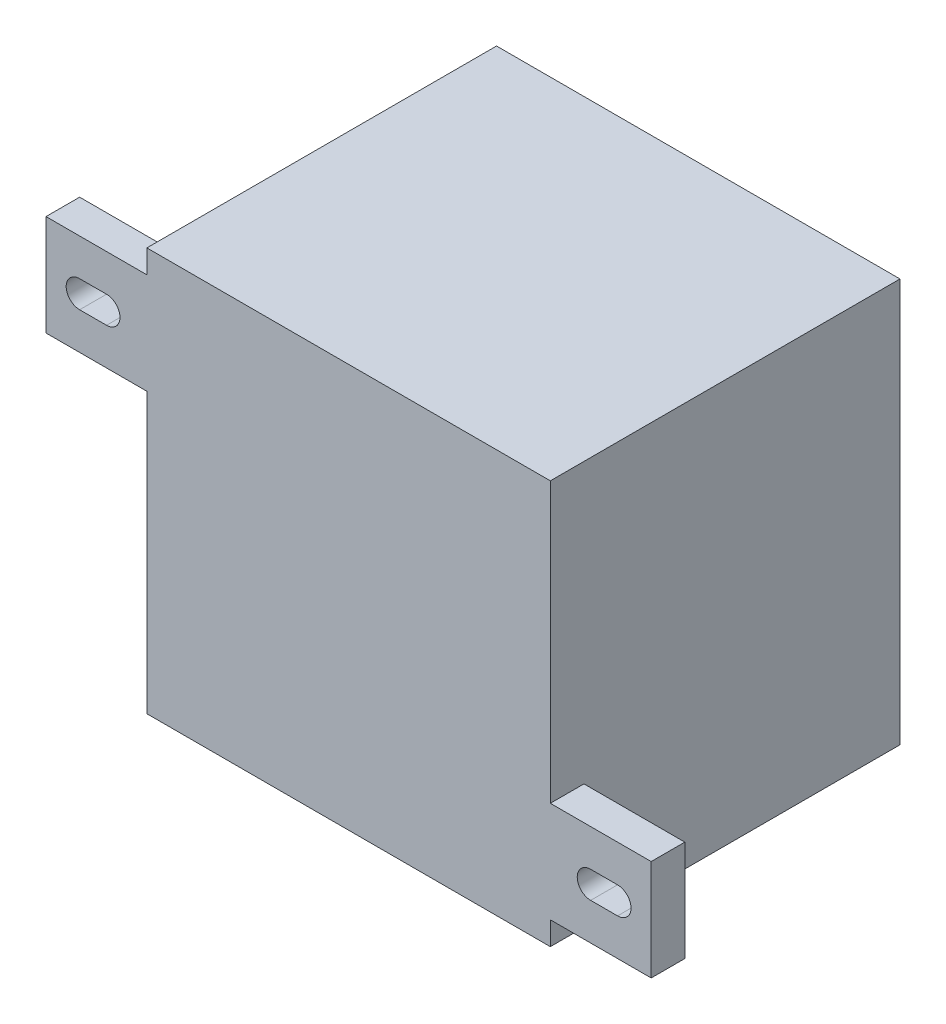
ISO-10303-21;
HEADER;
FILE_DESCRIPTION(('STEP AP214'),'2;1');
FILE_NAME('part.step','',(''),(''),'','','');
FILE_SCHEMA(('AUTOMOTIVE_DESIGN { 1 0 10303 214 1 1 1 1 }'));
ENDSEC;
DATA;
#1=APPLICATION_CONTEXT('core data for automotive mechanical design processes');
#2=APPLICATION_PROTOCOL_DEFINITION('international standard','automotive_design',2000,#1);
#3=PRODUCT_CONTEXT('',#1,'mechanical');
#4=PRODUCT('Part','Part','',(#3));
#5=PRODUCT_RELATED_PRODUCT_CATEGORY('part','',(#4));
#6=PRODUCT_DEFINITION_FORMATION('','',#4);
#7=PRODUCT_DEFINITION_CONTEXT('part definition',#1,'design');
#8=PRODUCT_DEFINITION('design','',#6,#7);
#9=PRODUCT_DEFINITION_SHAPE('','',#8);
#10=(LENGTH_UNIT() NAMED_UNIT(*) SI_UNIT(.MILLI.,.METRE.));
#11=(NAMED_UNIT(*) PLANE_ANGLE_UNIT() SI_UNIT($,.RADIAN.));
#12=(NAMED_UNIT(*) SI_UNIT($,.STERADIAN.) SOLID_ANGLE_UNIT());
#13=UNCERTAINTY_MEASURE_WITH_UNIT(LENGTH_MEASURE(1.E-05),#10,'distance_accuracy_value','');
#14=(GEOMETRIC_REPRESENTATION_CONTEXT(3) GLOBAL_UNCERTAINTY_ASSIGNED_CONTEXT((#13)) GLOBAL_UNIT_ASSIGNED_CONTEXT((#10,
#11,#12)) REPRESENTATION_CONTEXT('',''));
#15=CARTESIAN_POINT('',(0.,0.,0.));
#16=DIRECTION('',(0.,0.,1.));
#17=DIRECTION('',(1.,0.,0.));
#18=AXIS2_PLACEMENT_3D('',#15,#16,#17);
#19=CARTESIAN_POINT('',(30.,-30.,52.));
#20=DIRECTION('',(-1.,0.,0.));
#21=DIRECTION('',(0.,0.,1.));
#22=AXIS2_PLACEMENT_3D('',#19,#20,#21);
#23=PLANE('',#22);
#24=DIRECTION('',(0.,0.,1.));
#25=VECTOR('',#24,1.);
#26=CARTESIAN_POINT('',(29.9999999999991,-11.5328663106765,47.));
#27=LINE('',#26,#25);
#28=CARTESIAN_POINT('',(29.9999999999991,-11.5328663106765,47.));
#29=VERTEX_POINT('',#28);
#30=CARTESIAN_POINT('',(29.9999999999991,-11.5328663106765,52.));
#31=VERTEX_POINT('',#30);
#32=EDGE_CURVE('E234',#29,#31,#27,.T.);
#33=ORIENTED_EDGE('',*,*,#32,.F.);
#34=DIRECTION('',(0.,-1.,0.));
#35=VECTOR('',#34,1.);
#36=CARTESIAN_POINT('',(29.999999999998,-26.5328663106765,47.));
#37=LINE('',#36,#35);
#38=CARTESIAN_POINT('',(29.999999999998,-26.5328663106765,47.));
#39=VERTEX_POINT('',#38);
#40=EDGE_CURVE('E214',#29,#39,#37,.T.);
#41=ORIENTED_EDGE('',*,*,#40,.T.);
#42=DIRECTION('',(0.,0.,1.));
#43=VECTOR('',#42,1.);
#44=CARTESIAN_POINT('',(29.999999999998,-26.5328663106765,47.));
#45=LINE('',#44,#43);
#46=CARTESIAN_POINT('',(30.,-26.5328663106765,52.));
#47=VERTEX_POINT('',#46);
#48=EDGE_CURVE('E227',#39,#47,#45,.T.);
#49=ORIENTED_EDGE('',*,*,#48,.T.);
#50=DIRECTION('',(0.,1.,0.));
#51=VECTOR('',#50,1.);
#52=CARTESIAN_POINT('',(30.,-30.,52.));
#53=LINE('',#52,#51);
#54=CARTESIAN_POINT('',(30.,-30.,52.));
#55=VERTEX_POINT('',#54);
#56=EDGE_CURVE('E308',#55,#47,#53,.T.);
#57=ORIENTED_EDGE('',*,*,#56,.F.);
#58=DIRECTION('',(0.,0.,-1.));
#59=VECTOR('',#58,1.);
#60=CARTESIAN_POINT('',(30.,-30.,52.));
#61=LINE('',#60,#59);
#62=CARTESIAN_POINT('',(30.,-30.,0.));
#63=VERTEX_POINT('',#62);
#64=EDGE_CURVE('E42',#55,#63,#61,.T.);
#65=ORIENTED_EDGE('',*,*,#64,.T.);
#66=DIRECTION('',(0.,1.,0.));
#67=VECTOR('',#66,1.);
#68=CARTESIAN_POINT('',(30.,-30.,0.));
#69=LINE('',#68,#67);
#70=CARTESIAN_POINT('',(30.,30.,0.));
#71=VERTEX_POINT('',#70);
#72=EDGE_CURVE('E318',#63,#71,#69,.T.);
#73=ORIENTED_EDGE('',*,*,#72,.T.);
#74=DIRECTION('',(0.,0.,-1.));
#75=VECTOR('',#74,1.);
#76=CARTESIAN_POINT('',(30.,30.,52.));
#77=LINE('',#76,#75);
#78=CARTESIAN_POINT('',(30.,30.,52.));
#79=VERTEX_POINT('',#78);
#80=EDGE_CURVE('E324',#79,#71,#77,.T.);
#81=ORIENTED_EDGE('',*,*,#80,.F.);
#82=EDGE_CURVE('E307',#31,#79,#53,.T.);
#83=ORIENTED_EDGE('',*,*,#82,.F.);
#84=EDGE_LOOP('',(#33,#41,#49,#57,#65,#73,#81,#83));
#85=FACE_BOUND('',#84,.T.);
#86=ADVANCED_FACE('F34',(#85),#23,.F.);
#87=CARTESIAN_POINT('',(-30.,-30.,52.));
#88=DIRECTION('',(1.,0.,0.));
#89=DIRECTION('',(0.,0.,-1.));
#90=AXIS2_PLACEMENT_3D('',#87,#88,#89);
#91=PLANE('',#90);
#92=DIRECTION('',(0.,0.,1.));
#93=VECTOR('',#92,1.);
#94=CARTESIAN_POINT('',(-30.,11.5328663106743,47.));
#95=LINE('',#94,#93);
#96=CARTESIAN_POINT('',(-30.,11.5328663106743,47.));
#97=VERTEX_POINT('',#96);
#98=CARTESIAN_POINT('',(-30.,11.5328663106743,52.));
#99=VERTEX_POINT('',#98);
#100=EDGE_CURVE('E293',#97,#99,#95,.T.);
#101=ORIENTED_EDGE('',*,*,#100,.F.);
#102=DIRECTION('',(0.,1.,0.));
#103=VECTOR('',#102,1.);
#104=CARTESIAN_POINT('',(-30.,26.5328663106743,47.));
#105=LINE('',#104,#103);
#106=CARTESIAN_POINT('',(-30.,26.5328663106743,47.));
#107=VERTEX_POINT('',#106);
#108=EDGE_CURVE('E273',#97,#107,#105,.T.);
#109=ORIENTED_EDGE('',*,*,#108,.T.);
#110=DIRECTION('',(0.,0.,1.));
#111=VECTOR('',#110,1.);
#112=CARTESIAN_POINT('',(-30.,26.5328663106743,47.));
#113=LINE('',#112,#111);
#114=CARTESIAN_POINT('',(-30.,26.5328663106743,52.));
#115=VERTEX_POINT('',#114);
#116=EDGE_CURVE('E286',#107,#115,#113,.T.);
#117=ORIENTED_EDGE('',*,*,#116,.T.);
#118=DIRECTION('',(0.,-1.,0.));
#119=VECTOR('',#118,1.);
#120=CARTESIAN_POINT('',(-30.,-30.,52.));
#121=LINE('',#120,#119);
#122=CARTESIAN_POINT('',(-30.,30.,52.));
#123=VERTEX_POINT('',#122);
#124=EDGE_CURVE('E301',#123,#115,#121,.T.);
#125=ORIENTED_EDGE('',*,*,#124,.F.);
#126=DIRECTION('',(0.,0.,-1.));
#127=VECTOR('',#126,1.);
#128=CARTESIAN_POINT('',(-30.,30.,52.));
#129=LINE('',#128,#127);
#130=CARTESIAN_POINT('',(-30.,30.,0.));
#131=VERTEX_POINT('',#130);
#132=EDGE_CURVE('E313',#123,#131,#129,.T.);
#133=ORIENTED_EDGE('',*,*,#132,.T.);
#134=DIRECTION('',(0.,-1.,0.));
#135=VECTOR('',#134,1.);
#136=CARTESIAN_POINT('',(-30.,-30.,0.));
#137=LINE('',#136,#135);
#138=CARTESIAN_POINT('',(-30.,-30.,0.));
#139=VERTEX_POINT('',#138);
#140=EDGE_CURVE('E295',#131,#139,#137,.T.);
#141=ORIENTED_EDGE('',*,*,#140,.T.);
#142=DIRECTION('',(0.,0.,-1.));
#143=VECTOR('',#142,1.);
#144=CARTESIAN_POINT('',(-30.,-30.,52.));
#145=LINE('',#144,#143);
#146=CARTESIAN_POINT('',(-30.,-30.,52.));
#147=VERTEX_POINT('',#146);
#148=EDGE_CURVE('E11',#147,#139,#145,.T.);
#149=ORIENTED_EDGE('',*,*,#148,.F.);
#150=EDGE_CURVE('E305',#99,#147,#121,.T.);
#151=ORIENTED_EDGE('',*,*,#150,.F.);
#152=EDGE_LOOP('',(#101,#109,#117,#125,#133,#141,#149,#151));
#153=FACE_BOUND('',#152,.T.);
#154=ADVANCED_FACE('F36',(#153),#91,.F.);
#155=CARTESIAN_POINT('',(30.,-30.,52.));
#156=DIRECTION('',(0.,1.,0.));
#157=DIRECTION('',(-1.,0.,0.));
#158=AXIS2_PLACEMENT_3D('',#155,#156,#157);
#159=PLANE('',#158);
#160=DIRECTION('',(1.,0.,0.));
#161=VECTOR('',#160,1.);
#162=CARTESIAN_POINT('',(30.,-30.,0.));
#163=LINE('',#162,#161);
#164=EDGE_CURVE('E316',#139,#63,#163,.T.);
#165=ORIENTED_EDGE('',*,*,#164,.T.);
#166=ORIENTED_EDGE('',*,*,#64,.F.);
#167=DIRECTION('',(1.,0.,0.));
#168=VECTOR('',#167,1.);
#169=CARTESIAN_POINT('',(30.,-30.,52.));
#170=LINE('',#169,#168);
#171=EDGE_CURVE('E304',#147,#55,#170,.T.);
#172=ORIENTED_EDGE('',*,*,#171,.F.);
#173=ORIENTED_EDGE('',*,*,#148,.T.);
#174=EDGE_LOOP('',(#165,#166,#172,#173));
#175=FACE_BOUND('',#174,.T.);
#176=ADVANCED_FACE('F360',(#175),#159,.F.);
#177=CARTESIAN_POINT('',(30.,30.,52.));
#178=DIRECTION('',(0.,-1.,0.));
#179=DIRECTION('',(1.,0.,0.));
#180=AXIS2_PLACEMENT_3D('',#177,#178,#179);
#181=PLANE('',#180);
#182=DIRECTION('',(-1.,0.,0.));
#183=VECTOR('',#182,1.);
#184=CARTESIAN_POINT('',(30.,30.,0.));
#185=LINE('',#184,#183);
#186=EDGE_CURVE('E320',#71,#131,#185,.T.);
#187=ORIENTED_EDGE('',*,*,#186,.T.);
#188=ORIENTED_EDGE('',*,*,#132,.F.);
#189=DIRECTION('',(-1.,0.,0.));
#190=VECTOR('',#189,1.);
#191=CARTESIAN_POINT('',(30.,30.,52.));
#192=LINE('',#191,#190);
#193=EDGE_CURVE('E311',#79,#123,#192,.T.);
#194=ORIENTED_EDGE('',*,*,#193,.F.);
#195=ORIENTED_EDGE('',*,*,#80,.T.);
#196=EDGE_LOOP('',(#187,#188,#194,#195));
#197=FACE_BOUND('',#196,.T.);
#198=ADVANCED_FACE('F341',(#197),#181,.F.);
#199=CARTESIAN_POINT('',(0.,0.,52.));
#200=DIRECTION('',(0.,0.,1.));
#201=DIRECTION('',(1.,0.,0.));
#202=AXIS2_PLACEMENT_3D('',#199,#200,#201);
#203=PLANE('',#202);
#204=ORIENTED_EDGE('',*,*,#124,.T.);
#205=DIRECTION('',(-1.,0.,0.));
#206=VECTOR('',#205,1.);
#207=CARTESIAN_POINT('',(-30.,26.5328663106743,52.));
#208=LINE('',#207,#206);
#209=CARTESIAN_POINT('',(-45.,26.5328663106743,52.));
#210=VERTEX_POINT('',#209);
#211=EDGE_CURVE('E57',#115,#210,#208,.T.);
#212=ORIENTED_EDGE('',*,*,#211,.T.);
#213=DIRECTION('',(0.,-1.,0.));
#214=VECTOR('',#213,1.);
#215=CARTESIAN_POINT('',(-45.,26.5328663106743,52.));
#216=LINE('',#215,#214);
#217=CARTESIAN_POINT('',(-45.,11.5328663106743,52.));
#218=VERTEX_POINT('',#217);
#219=EDGE_CURVE('E288',#210,#218,#216,.T.);
#220=ORIENTED_EDGE('',*,*,#219,.T.);
#221=DIRECTION('',(1.,0.,0.));
#222=VECTOR('',#221,1.);
#223=CARTESIAN_POINT('',(-30.,11.5328663106743,52.));
#224=LINE('',#223,#222);
#225=EDGE_CURVE('E277',#218,#99,#224,.T.);
#226=ORIENTED_EDGE('',*,*,#225,.T.);
#227=ORIENTED_EDGE('',*,*,#150,.T.);
#228=ORIENTED_EDGE('',*,*,#171,.T.);
#229=ORIENTED_EDGE('',*,*,#56,.T.);
#230=DIRECTION('',(1.,0.,0.));
#231=VECTOR('',#230,1.);
#232=CARTESIAN_POINT('',(29.999999999998,-26.5328663106765,52.));
#233=LINE('',#232,#231);
#234=CARTESIAN_POINT('',(44.999999999998,-26.5328663106777,52.));
#235=VERTEX_POINT('',#234);
#236=EDGE_CURVE('E49',#47,#235,#233,.T.);
#237=ORIENTED_EDGE('',*,*,#236,.T.);
#238=DIRECTION('',(0.,1.,0.));
#239=VECTOR('',#238,1.);
#240=CARTESIAN_POINT('',(44.999999999998,-26.5328663106777,52.));
#241=LINE('',#240,#239);
#242=CARTESIAN_POINT('',(44.9999999999991,-11.5328663106777,52.));
#243=VERTEX_POINT('',#242);
#244=EDGE_CURVE('E229',#235,#243,#241,.T.);
#245=ORIENTED_EDGE('',*,*,#244,.T.);
#246=DIRECTION('',(-1.,0.,0.));
#247=VECTOR('',#246,1.);
#248=CARTESIAN_POINT('',(29.9999999999991,-11.5328663106765,52.));
#249=LINE('',#248,#247);
#250=EDGE_CURVE('E218',#243,#31,#249,.T.);
#251=ORIENTED_EDGE('',*,*,#250,.T.);
#252=ORIENTED_EDGE('',*,*,#82,.T.);
#253=ORIENTED_EDGE('',*,*,#193,.T.);
#254=EDGE_LOOP('',(#204,#212,#220,#226,#227,#228,#229,#237,#245,#251,#252,#253));
#255=FACE_BOUND('',#254,.T.);
#256=DIRECTION('',(1.,0.,0.));
#257=VECTOR('',#256,1.);
#258=CARTESIAN_POINT('',(-40.,17.0328663106743,52.));
#259=LINE('',#258,#257);
#260=CARTESIAN_POINT('',(-40.,17.0328663106743,52.));
#261=VERTEX_POINT('',#260);
#262=CARTESIAN_POINT('',(-36.,17.0328663106743,52.));
#263=VERTEX_POINT('',#262);
#264=EDGE_CURVE('E257',#261,#263,#259,.T.);
#265=ORIENTED_EDGE('',*,*,#264,.F.);
#266=CARTESIAN_POINT('',(-40.,19.0328663106743,52.));
#267=DIRECTION('',(0.,0.,1.));
#268=DIRECTION('',(1.,0.,0.));
#269=AXIS2_PLACEMENT_3D('',#266,#267,#268);
#270=CIRCLE('',#269,2.);
#271=CARTESIAN_POINT('',(-40.,21.0328663106743,52.));
#272=VERTEX_POINT('',#271);
#273=EDGE_CURVE('E236',#272,#261,#270,.T.);
#274=ORIENTED_EDGE('',*,*,#273,.F.);
#275=DIRECTION('',(-1.,0.,0.));
#276=VECTOR('',#275,1.);
#277=CARTESIAN_POINT('',(-40.,21.0328663106743,52.));
#278=LINE('',#277,#276);
#279=CARTESIAN_POINT('',(-36.,21.0328663106743,52.));
#280=VERTEX_POINT('',#279);
#281=EDGE_CURVE('E246',#280,#272,#278,.T.);
#282=ORIENTED_EDGE('',*,*,#281,.F.);
#283=CARTESIAN_POINT('',(-36.,19.0328663106743,52.));
#284=DIRECTION('',(0.,0.,1.));
#285=DIRECTION('',(1.,0.,0.));
#286=AXIS2_PLACEMENT_3D('',#283,#284,#285);
#287=CIRCLE('',#286,2.);
#288=EDGE_CURVE('E260',#263,#280,#287,.T.);
#289=ORIENTED_EDGE('',*,*,#288,.F.);
#290=EDGE_LOOP('',(#265,#274,#282,#289));
#291=FACE_BOUND('',#290,.T.);
#292=DIRECTION('',(-1.,0.,0.));
#293=VECTOR('',#292,1.);
#294=CARTESIAN_POINT('',(39.9999999999987,-17.0328663106773,52.));
#295=LINE('',#294,#293);
#296=CARTESIAN_POINT('',(39.9999999999987,-17.0328663106773,52.));
#297=VERTEX_POINT('',#296);
#298=CARTESIAN_POINT('',(35.9999999999987,-17.032866310677,52.));
#299=VERTEX_POINT('',#298);
#300=EDGE_CURVE('E205',#297,#299,#295,.T.);
#301=ORIENTED_EDGE('',*,*,#300,.F.);
#302=CARTESIAN_POINT('',(39.9999999999986,-19.0328663106773,52.));
#303=DIRECTION('',(0.,0.,1.));
#304=DIRECTION('',(1.,0.,0.));
#305=AXIS2_PLACEMENT_3D('',#302,#303,#304);
#306=CIRCLE('',#305,2.);
#307=CARTESIAN_POINT('',(39.9999999999984,-21.0328663106773,52.));
#308=VERTEX_POINT('',#307);
#309=EDGE_CURVE('E178',#308,#297,#306,.T.);
#310=ORIENTED_EDGE('',*,*,#309,.F.);
#311=DIRECTION('',(1.,0.,0.));
#312=VECTOR('',#311,1.);
#313=CARTESIAN_POINT('',(39.9999999999984,-21.0328663106773,52.));
#314=LINE('',#313,#312);
#315=CARTESIAN_POINT('',(35.9999999999984,-21.032866310677,52.));
#316=VERTEX_POINT('',#315);
#317=EDGE_CURVE('E196',#316,#308,#314,.T.);
#318=ORIENTED_EDGE('',*,*,#317,.F.);
#319=CARTESIAN_POINT('',(35.9999999999986,-19.032866310677,52.));
#320=DIRECTION('',(0.,0.,1.));
#321=DIRECTION('',(1.,0.,0.));
#322=AXIS2_PLACEMENT_3D('',#319,#320,#321);
#323=CIRCLE('',#322,2.);
#324=EDGE_CURVE('E199',#299,#316,#323,.T.);
#325=ORIENTED_EDGE('',*,*,#324,.F.);
#326=EDGE_LOOP('',(#301,#310,#318,#325));
#327=FACE_BOUND('',#326,.T.);
#328=ADVANCED_FACE('F348',(#255,#291,#327),#203,.T.);
#329=CARTESIAN_POINT('',(0.,0.,0.));
#330=DIRECTION('',(0.,0.,1.));
#331=DIRECTION('',(1.,0.,0.));
#332=AXIS2_PLACEMENT_3D('',#329,#330,#331);
#333=PLANE('',#332);
#334=ORIENTED_EDGE('',*,*,#140,.F.);
#335=ORIENTED_EDGE('',*,*,#186,.F.);
#336=ORIENTED_EDGE('',*,*,#72,.F.);
#337=ORIENTED_EDGE('',*,*,#164,.F.);
#338=EDGE_LOOP('',(#334,#335,#336,#337));
#339=FACE_BOUND('',#338,.T.);
#340=ADVANCED_FACE('F338',(#339),#333,.F.);
#341=CARTESIAN_POINT('',(-30.,11.5328663106743,47.));
#342=DIRECTION('',(0.,-1.,0.));
#343=DIRECTION('',(0.,0.,-1.));
#344=AXIS2_PLACEMENT_3D('',#341,#342,#343);
#345=PLANE('',#344);
#346=ORIENTED_EDGE('',*,*,#225,.F.);
#347=DIRECTION('',(0.,0.,1.));
#348=VECTOR('',#347,1.);
#349=CARTESIAN_POINT('',(-45.,11.5328663106743,47.));
#350=LINE('',#349,#348);
#351=CARTESIAN_POINT('',(-45.,11.5328663106743,47.));
#352=VERTEX_POINT('',#351);
#353=EDGE_CURVE('E296',#352,#218,#350,.T.);
#354=ORIENTED_EDGE('',*,*,#353,.F.);
#355=DIRECTION('',(1.,0.,0.));
#356=VECTOR('',#355,1.);
#357=CARTESIAN_POINT('',(-30.,11.5328663106743,47.));
#358=LINE('',#357,#356);
#359=EDGE_CURVE('E283',#352,#97,#358,.T.);
#360=ORIENTED_EDGE('',*,*,#359,.T.);
#361=ORIENTED_EDGE('',*,*,#100,.T.);
#362=EDGE_LOOP('',(#346,#354,#360,#361));
#363=FACE_BOUND('',#362,.T.);
#364=ADVANCED_FACE('F363',(#363),#345,.T.);
#365=CARTESIAN_POINT('',(-45.,26.5328663106743,47.));
#366=DIRECTION('',(-1.,0.,0.));
#367=DIRECTION('',(0.,0.,1.));
#368=AXIS2_PLACEMENT_3D('',#365,#366,#367);
#369=PLANE('',#368);
#370=ORIENTED_EDGE('',*,*,#219,.F.);
#371=DIRECTION('',(0.,0.,1.));
#372=VECTOR('',#371,1.);
#373=CARTESIAN_POINT('',(-45.,26.5328663106743,47.));
#374=LINE('',#373,#372);
#375=CARTESIAN_POINT('',(-45.,26.5328663106743,47.));
#376=VERTEX_POINT('',#375);
#377=EDGE_CURVE('E298',#376,#210,#374,.T.);
#378=ORIENTED_EDGE('',*,*,#377,.F.);
#379=DIRECTION('',(0.,-1.,0.));
#380=VECTOR('',#379,1.);
#381=CARTESIAN_POINT('',(-45.,26.5328663106743,47.));
#382=LINE('',#381,#380);
#383=EDGE_CURVE('E280',#376,#352,#382,.T.);
#384=ORIENTED_EDGE('',*,*,#383,.T.);
#385=ORIENTED_EDGE('',*,*,#353,.T.);
#386=EDGE_LOOP('',(#370,#378,#384,#385));
#387=FACE_BOUND('',#386,.T.);
#388=ADVANCED_FACE('F367',(#387),#369,.T.);
#389=CARTESIAN_POINT('',(-30.,26.5328663106743,47.));
#390=DIRECTION('',(0.,1.,0.));
#391=DIRECTION('',(0.,0.,1.));
#392=AXIS2_PLACEMENT_3D('',#389,#390,#391);
#393=PLANE('',#392);
#394=ORIENTED_EDGE('',*,*,#211,.F.);
#395=ORIENTED_EDGE('',*,*,#116,.F.);
#396=DIRECTION('',(-1.,0.,0.));
#397=VECTOR('',#396,1.);
#398=CARTESIAN_POINT('',(-30.,26.5328663106743,47.));
#399=LINE('',#398,#397);
#400=EDGE_CURVE('E276',#107,#376,#399,.T.);
#401=ORIENTED_EDGE('',*,*,#400,.T.);
#402=ORIENTED_EDGE('',*,*,#377,.T.);
#403=EDGE_LOOP('',(#394,#395,#401,#402));
#404=FACE_BOUND('',#403,.T.);
#405=ADVANCED_FACE('F372',(#404),#393,.T.);
#406=CARTESIAN_POINT('',(0.,0.,47.));
#407=DIRECTION('',(0.,0.,-1.));
#408=DIRECTION('',(-1.,0.,0.));
#409=AXIS2_PLACEMENT_3D('',#406,#407,#408);
#410=PLANE('',#409);
#411=CARTESIAN_POINT('',(-40.,19.0328663106743,47.));
#412=DIRECTION('',(0.,0.,1.));
#413=DIRECTION('',(1.,0.,0.));
#414=AXIS2_PLACEMENT_3D('',#411,#412,#413);
#415=CIRCLE('',#414,2.);
#416=CARTESIAN_POINT('',(-40.,21.0328663106743,47.));
#417=VERTEX_POINT('',#416);
#418=CARTESIAN_POINT('',(-40.,17.0328663106743,47.));
#419=VERTEX_POINT('',#418);
#420=EDGE_CURVE('E242',#417,#419,#415,.T.);
#421=ORIENTED_EDGE('',*,*,#420,.T.);
#422=DIRECTION('',(1.,0.,0.));
#423=VECTOR('',#422,1.);
#424=CARTESIAN_POINT('',(-40.,17.0328663106743,47.));
#425=LINE('',#424,#423);
#426=CARTESIAN_POINT('',(-36.,17.0328663106743,47.));
#427=VERTEX_POINT('',#426);
#428=EDGE_CURVE('E245',#419,#427,#425,.T.);
#429=ORIENTED_EDGE('',*,*,#428,.T.);
#430=CARTESIAN_POINT('',(-36.,19.0328663106743,47.));
#431=DIRECTION('',(0.,0.,1.));
#432=DIRECTION('',(1.,0.,0.));
#433=AXIS2_PLACEMENT_3D('',#430,#431,#432);
#434=CIRCLE('',#433,2.);
#435=CARTESIAN_POINT('',(-36.,21.0328663106743,47.));
#436=VERTEX_POINT('',#435);
#437=EDGE_CURVE('E249',#427,#436,#434,.T.);
#438=ORIENTED_EDGE('',*,*,#437,.T.);
#439=DIRECTION('',(-1.,0.,0.));
#440=VECTOR('',#439,1.);
#441=CARTESIAN_POINT('',(-40.,21.0328663106743,47.));
#442=LINE('',#441,#440);
#443=EDGE_CURVE('E252',#436,#417,#442,.T.);
#444=ORIENTED_EDGE('',*,*,#443,.T.);
#445=EDGE_LOOP('',(#421,#429,#438,#444));
#446=FACE_BOUND('',#445,.T.);
#447=ORIENTED_EDGE('',*,*,#108,.F.);
#448=ORIENTED_EDGE('',*,*,#359,.F.);
#449=ORIENTED_EDGE('',*,*,#383,.F.);
#450=ORIENTED_EDGE('',*,*,#400,.F.);
#451=EDGE_LOOP('',(#447,#448,#449,#450));
#452=FACE_BOUND('',#451,.T.);
#453=ADVANCED_FACE('F371',(#446,#452),#410,.T.);
#454=CARTESIAN_POINT('',(-40.,19.0328663106743,47.));
#455=DIRECTION('',(0.,0.,1.));
#456=DIRECTION('',(1.,0.,0.));
#457=AXIS2_PLACEMENT_3D('',#454,#455,#456);
#458=CYLINDRICAL_SURFACE('',#457,2.);
#459=ORIENTED_EDGE('',*,*,#273,.T.);
#460=DIRECTION('',(0.,0.,1.));
#461=VECTOR('',#460,1.);
#462=CARTESIAN_POINT('',(-40.,17.0328663106743,47.));
#463=LINE('',#462,#461);
#464=EDGE_CURVE('E255',#419,#261,#463,.T.);
#465=ORIENTED_EDGE('',*,*,#464,.F.);
#466=ORIENTED_EDGE('',*,*,#420,.F.);
#467=DIRECTION('',(0.,0.,1.));
#468=VECTOR('',#467,1.);
#469=CARTESIAN_POINT('',(-40.,21.0328663106743,47.));
#470=LINE('',#469,#468);
#471=EDGE_CURVE('E265',#417,#272,#470,.T.);
#472=ORIENTED_EDGE('',*,*,#471,.T.);
#473=EDGE_LOOP('',(#459,#465,#466,#472));
#474=FACE_BOUND('',#473,.T.);
#475=ADVANCED_FACE('F379',(#474),#458,.F.);
#476=CARTESIAN_POINT('',(-40.,21.0328663106743,47.));
#477=DIRECTION('',(0.,1.,0.));
#478=DIRECTION('',(0.,0.,1.));
#479=AXIS2_PLACEMENT_3D('',#476,#477,#478);
#480=PLANE('',#479);
#481=ORIENTED_EDGE('',*,*,#281,.T.);
#482=ORIENTED_EDGE('',*,*,#471,.F.);
#483=ORIENTED_EDGE('',*,*,#443,.F.);
#484=DIRECTION('',(0.,0.,1.));
#485=VECTOR('',#484,1.);
#486=CARTESIAN_POINT('',(-36.,21.0328663106743,47.));
#487=LINE('',#486,#485);
#488=EDGE_CURVE('E267',#436,#280,#487,.T.);
#489=ORIENTED_EDGE('',*,*,#488,.T.);
#490=EDGE_LOOP('',(#481,#482,#483,#489));
#491=FACE_BOUND('',#490,.T.);
#492=ADVANCED_FACE('F410',(#491),#480,.F.);
#493=CARTESIAN_POINT('',(-36.,19.0328663106743,47.));
#494=DIRECTION('',(0.,0.,1.));
#495=DIRECTION('',(1.,0.,0.));
#496=AXIS2_PLACEMENT_3D('',#493,#494,#495);
#497=CYLINDRICAL_SURFACE('',#496,2.);
#498=ORIENTED_EDGE('',*,*,#288,.T.);
#499=ORIENTED_EDGE('',*,*,#488,.F.);
#500=ORIENTED_EDGE('',*,*,#437,.F.);
#501=DIRECTION('',(0.,0.,1.));
#502=VECTOR('',#501,1.);
#503=CARTESIAN_POINT('',(-36.,17.0328663106743,47.));
#504=LINE('',#503,#502);
#505=EDGE_CURVE('E269',#427,#263,#504,.T.);
#506=ORIENTED_EDGE('',*,*,#505,.T.);
#507=EDGE_LOOP('',(#498,#499,#500,#506));
#508=FACE_BOUND('',#507,.T.);
#509=ADVANCED_FACE('F415',(#508),#497,.F.);
#510=CARTESIAN_POINT('',(-40.,17.0328663106743,47.));
#511=DIRECTION('',(0.,-1.,0.));
#512=DIRECTION('',(0.,0.,-1.));
#513=AXIS2_PLACEMENT_3D('',#510,#511,#512);
#514=PLANE('',#513);
#515=ORIENTED_EDGE('',*,*,#264,.T.);
#516=ORIENTED_EDGE('',*,*,#505,.F.);
#517=ORIENTED_EDGE('',*,*,#428,.F.);
#518=ORIENTED_EDGE('',*,*,#464,.T.);
#519=EDGE_LOOP('',(#515,#516,#517,#518));
#520=FACE_BOUND('',#519,.T.);
#521=ADVANCED_FACE('F412',(#520),#514,.F.);
#522=CARTESIAN_POINT('',(29.9999999999991,-11.5328663106765,47.));
#523=DIRECTION('',(0.,1.,0.));
#524=DIRECTION('',(-1.,0.,0.));
#525=AXIS2_PLACEMENT_3D('',#522,#523,#524);
#526=PLANE('',#525);
#527=ORIENTED_EDGE('',*,*,#250,.F.);
#528=DIRECTION('',(0.,0.,1.));
#529=VECTOR('',#528,1.);
#530=CARTESIAN_POINT('',(44.9999999999991,-11.5328663106777,47.));
#531=LINE('',#530,#529);
#532=CARTESIAN_POINT('',(44.9999999999991,-11.5328663106777,47.));
#533=VERTEX_POINT('',#532);
#534=EDGE_CURVE('E237',#533,#243,#531,.T.);
#535=ORIENTED_EDGE('',*,*,#534,.F.);
#536=DIRECTION('',(-1.,0.,0.));
#537=VECTOR('',#536,1.);
#538=CARTESIAN_POINT('',(29.9999999999991,-11.5328663106765,47.));
#539=LINE('',#538,#537);
#540=EDGE_CURVE('E224',#533,#29,#539,.T.);
#541=ORIENTED_EDGE('',*,*,#540,.T.);
#542=ORIENTED_EDGE('',*,*,#32,.T.);
#543=EDGE_LOOP('',(#527,#535,#541,#542));
#544=FACE_BOUND('',#543,.T.);
#545=ADVANCED_FACE('F353',(#544),#526,.T.);
#546=CARTESIAN_POINT('',(44.999999999998,-26.5328663106777,47.));
#547=DIRECTION('',(1.,0.,0.));
#548=DIRECTION('',(0.,1.,0.));
#549=AXIS2_PLACEMENT_3D('',#546,#547,#548);
#550=PLANE('',#549);
#551=ORIENTED_EDGE('',*,*,#244,.F.);
#552=DIRECTION('',(0.,0.,1.));
#553=VECTOR('',#552,1.);
#554=CARTESIAN_POINT('',(44.999999999998,-26.5328663106777,47.));
#555=LINE('',#554,#553);
#556=CARTESIAN_POINT('',(44.999999999998,-26.5328663106777,47.));
#557=VERTEX_POINT('',#556);
#558=EDGE_CURVE('E239',#557,#235,#555,.T.);
#559=ORIENTED_EDGE('',*,*,#558,.F.);
#560=DIRECTION('',(0.,1.,0.));
#561=VECTOR('',#560,1.);
#562=CARTESIAN_POINT('',(44.999999999998,-26.5328663106777,47.));
#563=LINE('',#562,#561);
#564=EDGE_CURVE('E221',#557,#533,#563,.T.);
#565=ORIENTED_EDGE('',*,*,#564,.T.);
#566=ORIENTED_EDGE('',*,*,#534,.T.);
#567=EDGE_LOOP('',(#551,#559,#565,#566));
#568=FACE_BOUND('',#567,.T.);
#569=ADVANCED_FACE('F425',(#568),#550,.T.);
#570=CARTESIAN_POINT('',(29.999999999998,-26.5328663106765,47.));
#571=DIRECTION('',(0.,-1.,0.));
#572=DIRECTION('',(1.,0.,0.));
#573=AXIS2_PLACEMENT_3D('',#570,#571,#572);
#574=PLANE('',#573);
#575=ORIENTED_EDGE('',*,*,#236,.F.);
#576=ORIENTED_EDGE('',*,*,#48,.F.);
#577=DIRECTION('',(1.,0.,0.));
#578=VECTOR('',#577,1.);
#579=CARTESIAN_POINT('',(29.999999999998,-26.5328663106765,47.));
#580=LINE('',#579,#578);
#581=EDGE_CURVE('E217',#39,#557,#580,.T.);
#582=ORIENTED_EDGE('',*,*,#581,.T.);
#583=ORIENTED_EDGE('',*,*,#558,.T.);
#584=EDGE_LOOP('',(#575,#576,#582,#583));
#585=FACE_BOUND('',#584,.T.);
#586=ADVANCED_FACE('F357',(#585),#574,.T.);
#587=CARTESIAN_POINT('',(0.,0.,47.));
#588=DIRECTION('',(0.,0.,-1.));
#589=DIRECTION('',(-1.,0.,0.));
#590=AXIS2_PLACEMENT_3D('',#587,#588,#589);
#591=PLANE('',#590);
#592=CARTESIAN_POINT('',(39.9999999999986,-19.0328663106773,47.));
#593=DIRECTION('',(0.,0.,1.));
#594=DIRECTION('',(1.,0.,0.));
#595=AXIS2_PLACEMENT_3D('',#592,#593,#594);
#596=CIRCLE('',#595,2.);
#597=CARTESIAN_POINT('',(39.9999999999984,-21.0328663106773,47.));
#598=VERTEX_POINT('',#597);
#599=CARTESIAN_POINT('',(39.9999999999987,-17.0328663106773,47.));
#600=VERTEX_POINT('',#599);
#601=EDGE_CURVE('E175',#598,#600,#596,.T.);
#602=ORIENTED_EDGE('',*,*,#601,.T.);
#603=DIRECTION('',(-1.,0.,0.));
#604=VECTOR('',#603,1.);
#605=CARTESIAN_POINT('',(39.9999999999987,-17.0328663106773,47.));
#606=LINE('',#605,#604);
#607=CARTESIAN_POINT('',(35.9999999999987,-17.032866310677,47.));
#608=VERTEX_POINT('',#607);
#609=EDGE_CURVE('E187',#600,#608,#606,.T.);
#610=ORIENTED_EDGE('',*,*,#609,.T.);
#611=CARTESIAN_POINT('',(35.9999999999986,-19.032866310677,47.));
#612=DIRECTION('',(0.,0.,1.));
#613=DIRECTION('',(1.,0.,0.));
#614=AXIS2_PLACEMENT_3D('',#611,#612,#613);
#615=CIRCLE('',#614,2.);
#616=CARTESIAN_POINT('',(35.9999999999984,-21.032866310677,47.));
#617=VERTEX_POINT('',#616);
#618=EDGE_CURVE('E191',#608,#617,#615,.T.);
#619=ORIENTED_EDGE('',*,*,#618,.T.);
#620=DIRECTION('',(1.,0.,0.));
#621=VECTOR('',#620,1.);
#622=CARTESIAN_POINT('',(39.9999999999984,-21.0328663106773,47.));
#623=LINE('',#622,#621);
#624=EDGE_CURVE('E183',#617,#598,#623,.T.);
#625=ORIENTED_EDGE('',*,*,#624,.T.);
#626=EDGE_LOOP('',(#602,#610,#619,#625));
#627=FACE_BOUND('',#626,.T.);
#628=ORIENTED_EDGE('',*,*,#40,.F.);
#629=ORIENTED_EDGE('',*,*,#540,.F.);
#630=ORIENTED_EDGE('',*,*,#564,.F.);
#631=ORIENTED_EDGE('',*,*,#581,.F.);
#632=EDGE_LOOP('',(#628,#629,#630,#631));
#633=FACE_BOUND('',#632,.T.);
#634=ADVANCED_FACE('F193',(#627,#633),#591,.T.);
#635=CARTESIAN_POINT('',(39.9999999999986,-19.0328663106773,47.));
#636=DIRECTION('',(0.,0.,1.));
#637=DIRECTION('',(1.,0.,0.));
#638=AXIS2_PLACEMENT_3D('',#635,#636,#637);
#639=CYLINDRICAL_SURFACE('',#638,2.);
#640=ORIENTED_EDGE('',*,*,#309,.T.);
#641=DIRECTION('',(0.,0.,1.));
#642=VECTOR('',#641,1.);
#643=CARTESIAN_POINT('',(39.9999999999987,-17.0328663106773,47.));
#644=LINE('',#643,#642);
#645=EDGE_CURVE('E171',#600,#297,#644,.T.);
#646=ORIENTED_EDGE('',*,*,#645,.F.);
#647=ORIENTED_EDGE('',*,*,#601,.F.);
#648=DIRECTION('',(0.,0.,1.));
#649=VECTOR('',#648,1.);
#650=CARTESIAN_POINT('',(39.9999999999984,-21.0328663106773,47.));
#651=LINE('',#650,#649);
#652=EDGE_CURVE('E209',#598,#308,#651,.T.);
#653=ORIENTED_EDGE('',*,*,#652,.T.);
#654=EDGE_LOOP('',(#640,#646,#647,#653));
#655=FACE_BOUND('',#654,.T.);
#656=ADVANCED_FACE('F173',(#655),#639,.F.);
#657=CARTESIAN_POINT('',(39.9999999999984,-21.0328663106773,47.));
#658=DIRECTION('',(0.,-1.,0.));
#659=DIRECTION('',(1.,0.,0.));
#660=AXIS2_PLACEMENT_3D('',#657,#658,#659);
#661=PLANE('',#660);
#662=ORIENTED_EDGE('',*,*,#317,.T.);
#663=ORIENTED_EDGE('',*,*,#652,.F.);
#664=ORIENTED_EDGE('',*,*,#624,.F.);
#665=DIRECTION('',(0.,0.,1.));
#666=VECTOR('',#665,1.);
#667=CARTESIAN_POINT('',(35.9999999999984,-21.032866310677,47.));
#668=LINE('',#667,#666);
#669=EDGE_CURVE('E211',#617,#316,#668,.T.);
#670=ORIENTED_EDGE('',*,*,#669,.T.);
#671=EDGE_LOOP('',(#662,#663,#664,#670));
#672=FACE_BOUND('',#671,.T.);
#673=ADVANCED_FACE('F435',(#672),#661,.F.);
#674=CARTESIAN_POINT('',(35.9999999999986,-19.032866310677,47.));
#675=DIRECTION('',(0.,0.,1.));
#676=DIRECTION('',(1.,0.,0.));
#677=AXIS2_PLACEMENT_3D('',#674,#675,#676);
#678=CYLINDRICAL_SURFACE('',#677,2.);
#679=ORIENTED_EDGE('',*,*,#324,.T.);
#680=ORIENTED_EDGE('',*,*,#669,.F.);
#681=ORIENTED_EDGE('',*,*,#618,.F.);
#682=DIRECTION('',(0.,0.,1.));
#683=VECTOR('',#682,1.);
#684=CARTESIAN_POINT('',(35.9999999999987,-17.032866310677,47.));
#685=LINE('',#684,#683);
#686=EDGE_CURVE('E182',#608,#299,#685,.T.);
#687=ORIENTED_EDGE('',*,*,#686,.T.);
#688=EDGE_LOOP('',(#679,#680,#681,#687));
#689=FACE_BOUND('',#688,.T.);
#690=ADVANCED_FACE('F438',(#689),#678,.F.);
#691=CARTESIAN_POINT('',(39.9999999999987,-17.0328663106773,47.));
#692=DIRECTION('',(0.,1.,0.));
#693=DIRECTION('',(-1.,0.,0.));
#694=AXIS2_PLACEMENT_3D('',#691,#692,#693);
#695=PLANE('',#694);
#696=ORIENTED_EDGE('',*,*,#300,.T.);
#697=ORIENTED_EDGE('',*,*,#686,.F.);
#698=ORIENTED_EDGE('',*,*,#609,.F.);
#699=ORIENTED_EDGE('',*,*,#645,.T.);
#700=EDGE_LOOP('',(#696,#697,#698,#699));
#701=FACE_BOUND('',#700,.T.);
#702=ADVANCED_FACE('F188',(#701),#695,.F.);
#703=CLOSED_SHELL('',(#86,#154,#176,#198,#328,#340,#364,#388,#405,#453,#475,#492,#509,#521,#545,
#569,#586,#634,#656,#673,#690,#702));
#704=MANIFOLD_SOLID_BREP('B2',#703);
#705=ADVANCED_BREP_SHAPE_REPRESENTATION('',(#18,#704),#14);
#706=SHAPE_DEFINITION_REPRESENTATION(#9,#705);
ENDSEC;
END-ISO-10303-21;
